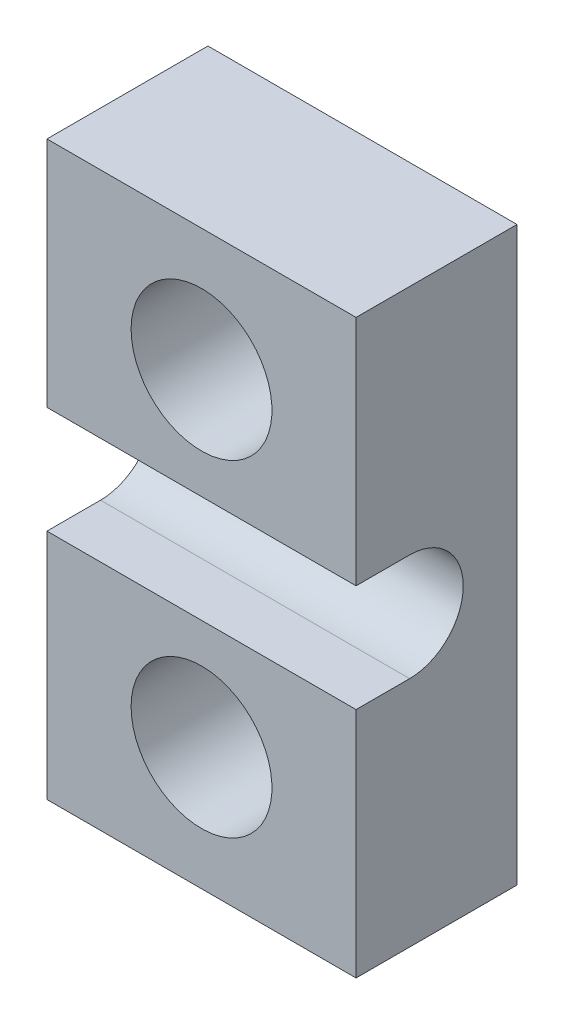
ISO-10303-21;
HEADER;
FILE_DESCRIPTION(('STEP AP214'),'2;1');
FILE_NAME('part.step','',(''),(''),'','','');
FILE_SCHEMA(('AUTOMOTIVE_DESIGN { 1 0 10303 214 1 1 1 1 }'));
ENDSEC;
DATA;
#1=APPLICATION_CONTEXT('core data for automotive mechanical design processes');
#2=APPLICATION_PROTOCOL_DEFINITION('international standard','automotive_design',2000,#1);
#3=PRODUCT_CONTEXT('',#1,'mechanical');
#4=PRODUCT('Part','Part','',(#3));
#5=PRODUCT_RELATED_PRODUCT_CATEGORY('part','',(#4));
#6=PRODUCT_DEFINITION_FORMATION('','',#4);
#7=PRODUCT_DEFINITION_CONTEXT('part definition',#1,'design');
#8=PRODUCT_DEFINITION('design','',#6,#7);
#9=PRODUCT_DEFINITION_SHAPE('','',#8);
#10=(LENGTH_UNIT() NAMED_UNIT(*) SI_UNIT(.MILLI.,.METRE.));
#11=(NAMED_UNIT(*) PLANE_ANGLE_UNIT() SI_UNIT($,.RADIAN.));
#12=(NAMED_UNIT(*) SI_UNIT($,.STERADIAN.) SOLID_ANGLE_UNIT());
#13=UNCERTAINTY_MEASURE_WITH_UNIT(LENGTH_MEASURE(1.E-05),#10,'distance_accuracy_value','');
#14=(GEOMETRIC_REPRESENTATION_CONTEXT(3) GLOBAL_UNCERTAINTY_ASSIGNED_CONTEXT((#13)) GLOBAL_UNIT_ASSIGNED_CONTEXT((#10,
#11,#12)) REPRESENTATION_CONTEXT('',''));
#15=CARTESIAN_POINT('',(0.,0.,0.));
#16=DIRECTION('',(0.,0.,1.));
#17=DIRECTION('',(1.,0.,0.));
#18=AXIS2_PLACEMENT_3D('',#15,#16,#17);
#19=CARTESIAN_POINT('',(0.,0.,3.2));
#20=DIRECTION('',(0.,0.,-1.));
#21=DIRECTION('',(-1.,0.,0.));
#22=AXIS2_PLACEMENT_3D('',#19,#20,#21);
#23=PLANE('',#22);
#24=CARTESIAN_POINT('',(213.478545955132,134.987907073244,3.2));
#25=DIRECTION('',(0.,0.,-1.));
#26=DIRECTION('',(-1.,0.,0.));
#27=AXIS2_PLACEMENT_3D('',#24,#25,#26);
#28=CIRCLE('',#27,1.40000000000001);
#29=CARTESIAN_POINT('',(212.078545955132,134.987907073244,3.2));
#30=VERTEX_POINT('',#29);
#31=EDGE_CURVE('E149',#30,#30,#28,.T.);
#32=ORIENTED_EDGE('',*,*,#31,.T.);
#33=EDGE_LOOP('',(#32));
#34=FACE_BOUND('',#33,.T.);
#35=DIRECTION('',(0.,1.,0.));
#36=VECTOR('',#35,1.);
#37=CARTESIAN_POINT('',(216.550959064884,143.924566425503,3.2));
#38=LINE('',#37,#36);
#39=CARTESIAN_POINT('',(216.550959064884,132.551247720986,3.2));
#40=VERTEX_POINT('',#39);
#41=CARTESIAN_POINT('',(216.550959064884,137.172907073244,3.2));
#42=VERTEX_POINT('',#41);
#43=EDGE_CURVE('E154',#40,#42,#38,.T.);
#44=ORIENTED_EDGE('',*,*,#43,.T.);
#45=DIRECTION('',(1.,0.,0.));
#46=VECTOR('',#45,1.);
#47=CARTESIAN_POINT('',(210.406132845381,137.172907073244,3.2));
#48=LINE('',#47,#46);
#49=CARTESIAN_POINT('',(210.406132845381,137.172907073244,3.2));
#50=VERTEX_POINT('',#49);
#51=EDGE_CURVE('E139',#50,#42,#48,.T.);
#52=ORIENTED_EDGE('',*,*,#51,.F.);
#53=DIRECTION('',(0.,-1.,0.));
#54=VECTOR('',#53,1.);
#55=CARTESIAN_POINT('',(210.406132845381,143.924566425503,3.2));
#56=LINE('',#55,#54);
#57=CARTESIAN_POINT('',(210.406132845381,132.551247720986,3.2));
#58=VERTEX_POINT('',#57);
#59=EDGE_CURVE('E158',#50,#58,#56,.T.);
#60=ORIENTED_EDGE('',*,*,#59,.T.);
#61=DIRECTION('',(1.,0.,0.));
#62=VECTOR('',#61,1.);
#63=CARTESIAN_POINT('',(216.550959064884,132.551247720986,3.2));
#64=LINE('',#63,#62);
#65=EDGE_CURVE('E57',#58,#40,#64,.T.);
#66=ORIENTED_EDGE('',*,*,#65,.T.);
#67=EDGE_LOOP('',(#44,#52,#60,#66));
#68=FACE_BOUND('',#67,.T.);
#69=ADVANCED_FACE('F33',(#34,#68),#23,.F.);
#70=CARTESIAN_POINT('',(216.550959064884,143.924566425503,3.2));
#71=DIRECTION('',(-1.,0.,0.));
#72=DIRECTION('',(0.,0.,1.));
#73=AXIS2_PLACEMENT_3D('',#70,#71,#72);
#74=PLANE('',#73);
#75=CARTESIAN_POINT('',(216.550959064884,138.237907073244,2.135));
#76=DIRECTION('',(1.,0.,0.));
#77=DIRECTION('',(0.,0.,-1.));
#78=AXIS2_PLACEMENT_3D('',#75,#76,#77);
#79=CIRCLE('',#78,1.06499999999998);
#80=CARTESIAN_POINT('',(216.550959064884,137.172907073244,2.135));
#81=VERTEX_POINT('',#80);
#82=CARTESIAN_POINT('',(216.550959064884,139.302907073244,2.135));
#83=VERTEX_POINT('',#82);
#84=EDGE_CURVE('E115',#81,#83,#79,.T.);
#85=ORIENTED_EDGE('',*,*,#84,.F.);
#86=DIRECTION('',(0.,0.,-1.));
#87=VECTOR('',#86,1.);
#88=CARTESIAN_POINT('',(216.550959064884,137.172907073244,2.135));
#89=LINE('',#88,#87);
#90=EDGE_CURVE('E128',#42,#81,#89,.T.);
#91=ORIENTED_EDGE('',*,*,#90,.F.);
#92=ORIENTED_EDGE('',*,*,#43,.F.);
#93=DIRECTION('',(0.,0.,-1.));
#94=VECTOR('',#93,1.);
#95=CARTESIAN_POINT('',(216.550959064884,132.551247720986,3.2));
#96=LINE('',#95,#94);
#97=CARTESIAN_POINT('',(216.550959064884,132.551247720986,0.));
#98=VERTEX_POINT('',#97);
#99=EDGE_CURVE('E162',#40,#98,#96,.T.);
#100=ORIENTED_EDGE('',*,*,#99,.T.);
#101=DIRECTION('',(0.,1.,0.));
#102=VECTOR('',#101,1.);
#103=CARTESIAN_POINT('',(216.550959064884,143.924566425503,0.));
#104=LINE('',#103,#102);
#105=CARTESIAN_POINT('',(216.550959064884,143.924566425503,0.));
#106=VERTEX_POINT('',#105);
#107=EDGE_CURVE('E145',#98,#106,#104,.T.);
#108=ORIENTED_EDGE('',*,*,#107,.T.);
#109=DIRECTION('',(0.,0.,-1.));
#110=VECTOR('',#109,1.);
#111=CARTESIAN_POINT('',(216.550959064884,143.924566425503,3.2));
#112=LINE('',#111,#110);
#113=CARTESIAN_POINT('',(216.550959064884,143.924566425503,3.2));
#114=VERTEX_POINT('',#113);
#115=EDGE_CURVE('E11',#114,#106,#112,.T.);
#116=ORIENTED_EDGE('',*,*,#115,.F.);
#117=CARTESIAN_POINT('',(216.550959064884,139.302907073244,3.2));
#118=VERTEX_POINT('',#117);
#119=EDGE_CURVE('E85',#118,#114,#38,.T.);
#120=ORIENTED_EDGE('',*,*,#119,.F.);
#121=DIRECTION('',(0.,0.,1.));
#122=VECTOR('',#121,1.);
#123=CARTESIAN_POINT('',(216.550959064884,139.302907073244,2.135));
#124=LINE('',#123,#122);
#125=EDGE_CURVE('E48',#83,#118,#124,.T.);
#126=ORIENTED_EDGE('',*,*,#125,.F.);
#127=EDGE_LOOP('',(#85,#91,#92,#100,#108,#116,#120,#126));
#128=FACE_BOUND('',#127,.T.);
#129=ADVANCED_FACE('F35',(#128),#74,.F.);
#130=CARTESIAN_POINT('',(216.550959064884,143.924566425503,3.2));
#131=DIRECTION('',(0.,-1.,0.));
#132=DIRECTION('',(0.,0.,-1.));
#133=AXIS2_PLACEMENT_3D('',#130,#131,#132);
#134=PLANE('',#133);
#135=DIRECTION('',(-1.,0.,0.));
#136=VECTOR('',#135,1.);
#137=CARTESIAN_POINT('',(216.550959064884,143.924566425503,0.));
#138=LINE('',#137,#136);
#139=CARTESIAN_POINT('',(210.406132845381,143.924566425503,0.));
#140=VERTEX_POINT('',#139);
#141=EDGE_CURVE('E165',#106,#140,#138,.T.);
#142=ORIENTED_EDGE('',*,*,#141,.T.);
#143=DIRECTION('',(0.,0.,-1.));
#144=VECTOR('',#143,1.);
#145=CARTESIAN_POINT('',(210.406132845381,143.924566425503,3.2));
#146=LINE('',#145,#144);
#147=CARTESIAN_POINT('',(210.406132845381,143.924566425503,3.2));
#148=VERTEX_POINT('',#147);
#149=EDGE_CURVE('E41',#148,#140,#146,.T.);
#150=ORIENTED_EDGE('',*,*,#149,.F.);
#151=DIRECTION('',(-1.,0.,0.));
#152=VECTOR('',#151,1.);
#153=CARTESIAN_POINT('',(216.550959064884,143.924566425503,3.2));
#154=LINE('',#153,#152);
#155=EDGE_CURVE('E156',#114,#148,#154,.T.);
#156=ORIENTED_EDGE('',*,*,#155,.F.);
#157=ORIENTED_EDGE('',*,*,#115,.T.);
#158=EDGE_LOOP('',(#142,#150,#156,#157));
#159=FACE_BOUND('',#158,.T.);
#160=ADVANCED_FACE('F204',(#159),#134,.F.);
#161=CARTESIAN_POINT('',(210.406132845381,143.924566425503,3.2));
#162=DIRECTION('',(1.,0.,0.));
#163=DIRECTION('',(0.,0.,-1.));
#164=AXIS2_PLACEMENT_3D('',#161,#162,#163);
#165=PLANE('',#164);
#166=ORIENTED_EDGE('',*,*,#59,.F.);
#167=DIRECTION('',(0.,0.,-1.));
#168=VECTOR('',#167,1.);
#169=CARTESIAN_POINT('',(210.406132845381,137.172907073244,2.135));
#170=LINE('',#169,#168);
#171=CARTESIAN_POINT('',(210.406132845381,137.172907073244,2.135));
#172=VERTEX_POINT('',#171);
#173=EDGE_CURVE('E117',#50,#172,#170,.T.);
#174=ORIENTED_EDGE('',*,*,#173,.T.);
#175=CARTESIAN_POINT('',(210.406132845381,138.237907073244,2.135));
#176=DIRECTION('',(1.,0.,0.));
#177=DIRECTION('',(0.,0.,-1.));
#178=AXIS2_PLACEMENT_3D('',#175,#176,#177);
#179=CIRCLE('',#178,1.06499999999998);
#180=CARTESIAN_POINT('',(210.406132845381,139.302907073244,2.135));
#181=VERTEX_POINT('',#180);
#182=EDGE_CURVE('E112',#172,#181,#179,.T.);
#183=ORIENTED_EDGE('',*,*,#182,.T.);
#184=DIRECTION('',(0.,0.,1.));
#185=VECTOR('',#184,1.);
#186=CARTESIAN_POINT('',(210.406132845381,139.302907073244,2.135));
#187=LINE('',#186,#185);
#188=CARTESIAN_POINT('',(210.406132845381,139.302907073244,3.2));
#189=VERTEX_POINT('',#188);
#190=EDGE_CURVE('E120',#181,#189,#187,.T.);
#191=ORIENTED_EDGE('',*,*,#190,.T.);
#192=EDGE_CURVE('E159',#148,#189,#56,.T.);
#193=ORIENTED_EDGE('',*,*,#192,.F.);
#194=ORIENTED_EDGE('',*,*,#149,.T.);
#195=DIRECTION('',(0.,-1.,0.));
#196=VECTOR('',#195,1.);
#197=CARTESIAN_POINT('',(210.406132845381,143.924566425503,0.));
#198=LINE('',#197,#196);
#199=CARTESIAN_POINT('',(210.406132845381,132.551247720986,0.));
#200=VERTEX_POINT('',#199);
#201=EDGE_CURVE('E167',#140,#200,#198,.T.);
#202=ORIENTED_EDGE('',*,*,#201,.T.);
#203=DIRECTION('',(0.,0.,-1.));
#204=VECTOR('',#203,1.);
#205=CARTESIAN_POINT('',(210.406132845381,132.551247720986,3.2));
#206=LINE('',#205,#204);
#207=EDGE_CURVE('E171',#58,#200,#206,.T.);
#208=ORIENTED_EDGE('',*,*,#207,.F.);
#209=EDGE_LOOP('',(#166,#174,#183,#191,#193,#194,#202,#208));
#210=FACE_BOUND('',#209,.T.);
#211=ADVANCED_FACE('F127',(#210),#165,.F.);
#212=CARTESIAN_POINT('',(216.550959064884,132.551247720986,3.2));
#213=DIRECTION('',(0.,1.,0.));
#214=DIRECTION('',(0.,0.,1.));
#215=AXIS2_PLACEMENT_3D('',#212,#213,#214);
#216=PLANE('',#215);
#217=DIRECTION('',(1.,0.,0.));
#218=VECTOR('',#217,1.);
#219=CARTESIAN_POINT('',(216.550959064884,132.551247720986,0.));
#220=LINE('',#219,#218);
#221=EDGE_CURVE('E78',#200,#98,#220,.T.);
#222=ORIENTED_EDGE('',*,*,#221,.T.);
#223=ORIENTED_EDGE('',*,*,#99,.F.);
#224=ORIENTED_EDGE('',*,*,#65,.F.);
#225=ORIENTED_EDGE('',*,*,#207,.T.);
#226=EDGE_LOOP('',(#222,#223,#224,#225));
#227=FACE_BOUND('',#226,.T.);
#228=ADVANCED_FACE('F184',(#227),#216,.F.);
#229=CARTESIAN_POINT('',(213.478545955132,141.487907073244,3.2));
#230=DIRECTION('',(0.,0.,-1.));
#231=DIRECTION('',(-1.,0.,0.));
#232=AXIS2_PLACEMENT_3D('',#229,#230,#231);
#233=CIRCLE('',#232,1.40000000000001);
#234=CARTESIAN_POINT('',(212.078545955132,141.487907073244,3.2));
#235=VERTEX_POINT('',#234);
#236=EDGE_CURVE('E142',#235,#235,#233,.T.);
#237=ORIENTED_EDGE('',*,*,#236,.T.);
#238=EDGE_LOOP('',(#237));
#239=FACE_BOUND('',#238,.T.);
#240=ORIENTED_EDGE('',*,*,#192,.T.);
#241=DIRECTION('',(1.,0.,0.));
#242=VECTOR('',#241,1.);
#243=CARTESIAN_POINT('',(210.406132845381,139.302907073244,3.2));
#244=LINE('',#243,#242);
#245=EDGE_CURVE('E116',#189,#118,#244,.T.);
#246=ORIENTED_EDGE('',*,*,#245,.T.);
#247=ORIENTED_EDGE('',*,*,#119,.T.);
#248=ORIENTED_EDGE('',*,*,#155,.T.);
#249=EDGE_LOOP('',(#240,#246,#247,#248));
#250=FACE_BOUND('',#249,.T.);
#251=ADVANCED_FACE('F200',(#239,#250),#23,.F.);
#252=CARTESIAN_POINT('',(0.,0.,0.));
#253=DIRECTION('',(0.,0.,-1.));
#254=DIRECTION('',(-1.,0.,0.));
#255=AXIS2_PLACEMENT_3D('',#252,#253,#254);
#256=PLANE('',#255);
#257=CARTESIAN_POINT('',(213.478545955132,141.487907073244,0.));
#258=DIRECTION('',(0.,0.,-1.));
#259=DIRECTION('',(-1.,0.,0.));
#260=AXIS2_PLACEMENT_3D('',#257,#258,#259);
#261=CIRCLE('',#260,1.40000000000001);
#262=CARTESIAN_POINT('',(212.078545955132,141.487907073244,0.));
#263=VERTEX_POINT('',#262);
#264=EDGE_CURVE('E146',#263,#263,#261,.T.);
#265=ORIENTED_EDGE('',*,*,#264,.F.);
#266=EDGE_LOOP('',(#265));
#267=FACE_BOUND('',#266,.T.);
#268=CARTESIAN_POINT('',(213.478545955132,134.987907073244,0.));
#269=DIRECTION('',(0.,0.,-1.));
#270=DIRECTION('',(-1.,0.,0.));
#271=AXIS2_PLACEMENT_3D('',#268,#269,#270);
#272=CIRCLE('',#271,1.40000000000001);
#273=CARTESIAN_POINT('',(212.078545955132,134.987907073244,0.));
#274=VERTEX_POINT('',#273);
#275=EDGE_CURVE('E138',#274,#274,#272,.T.);
#276=ORIENTED_EDGE('',*,*,#275,.F.);
#277=EDGE_LOOP('',(#276));
#278=FACE_BOUND('',#277,.T.);
#279=ORIENTED_EDGE('',*,*,#107,.F.);
#280=ORIENTED_EDGE('',*,*,#221,.F.);
#281=ORIENTED_EDGE('',*,*,#201,.F.);
#282=ORIENTED_EDGE('',*,*,#141,.F.);
#283=EDGE_LOOP('',(#279,#280,#281,#282));
#284=FACE_BOUND('',#283,.T.);
#285=ADVANCED_FACE('F179',(#267,#278,#284),#256,.T.);
#286=CARTESIAN_POINT('',(213.478545955132,134.987907073244,3.2));
#287=DIRECTION('',(0.,0.,-1.));
#288=DIRECTION('',(-1.,0.,0.));
#289=AXIS2_PLACEMENT_3D('',#286,#287,#288);
#290=CYLINDRICAL_SURFACE('',#289,1.40000000000001);
#291=ORIENTED_EDGE('',*,*,#31,.F.);
#292=EDGE_LOOP('',(#291));
#293=FACE_BOUND('',#292,.T.);
#294=ORIENTED_EDGE('',*,*,#275,.T.);
#295=EDGE_LOOP('',(#294));
#296=FACE_BOUND('',#295,.T.);
#297=ADVANCED_FACE('F213',(#293,#296),#290,.F.);
#298=CARTESIAN_POINT('',(213.478545955132,141.487907073244,3.2));
#299=DIRECTION('',(0.,0.,-1.));
#300=DIRECTION('',(-1.,0.,0.));
#301=AXIS2_PLACEMENT_3D('',#298,#299,#300);
#302=CYLINDRICAL_SURFACE('',#301,1.40000000000001);
#303=ORIENTED_EDGE('',*,*,#236,.F.);
#304=EDGE_LOOP('',(#303));
#305=FACE_BOUND('',#304,.T.);
#306=ORIENTED_EDGE('',*,*,#264,.T.);
#307=EDGE_LOOP('',(#306));
#308=FACE_BOUND('',#307,.T.);
#309=ADVANCED_FACE('F195',(#305,#308),#302,.F.);
#310=CARTESIAN_POINT('',(210.406132845381,138.237907073244,2.135));
#311=DIRECTION('',(1.,0.,0.));
#312=DIRECTION('',(0.,0.,-1.));
#313=AXIS2_PLACEMENT_3D('',#310,#311,#312);
#314=CYLINDRICAL_SURFACE('',#313,1.06499999999998);
#315=ORIENTED_EDGE('',*,*,#84,.T.);
#316=DIRECTION('',(1.,0.,0.));
#317=VECTOR('',#316,1.);
#318=CARTESIAN_POINT('',(210.406132845381,139.302907073244,2.135));
#319=LINE('',#318,#317);
#320=EDGE_CURVE('E108',#181,#83,#319,.T.);
#321=ORIENTED_EDGE('',*,*,#320,.F.);
#322=ORIENTED_EDGE('',*,*,#182,.F.);
#323=DIRECTION('',(1.,0.,0.));
#324=VECTOR('',#323,1.);
#325=CARTESIAN_POINT('',(210.406132845381,137.172907073244,2.135));
#326=LINE('',#325,#324);
#327=EDGE_CURVE('E136',#172,#81,#326,.T.);
#328=ORIENTED_EDGE('',*,*,#327,.T.);
#329=EDGE_LOOP('',(#315,#321,#322,#328));
#330=FACE_BOUND('',#329,.T.);
#331=ADVANCED_FACE('F110',(#330),#314,.F.);
#332=CARTESIAN_POINT('',(210.406132845381,137.172907073244,2.135));
#333=DIRECTION('',(0.,-1.,0.));
#334=DIRECTION('',(0.,0.,-1.));
#335=AXIS2_PLACEMENT_3D('',#332,#333,#334);
#336=PLANE('',#335);
#337=ORIENTED_EDGE('',*,*,#90,.T.);
#338=ORIENTED_EDGE('',*,*,#327,.F.);
#339=ORIENTED_EDGE('',*,*,#173,.F.);
#340=ORIENTED_EDGE('',*,*,#51,.T.);
#341=EDGE_LOOP('',(#337,#338,#339,#340));
#342=FACE_BOUND('',#341,.T.);
#343=ADVANCED_FACE('F187',(#342),#336,.F.);
#344=CARTESIAN_POINT('',(210.406132845381,139.302907073244,2.135));
#345=DIRECTION('',(0.,1.,0.));
#346=DIRECTION('',(0.,0.,1.));
#347=AXIS2_PLACEMENT_3D('',#344,#345,#346);
#348=PLANE('',#347);
#349=ORIENTED_EDGE('',*,*,#125,.T.);
#350=ORIENTED_EDGE('',*,*,#245,.F.);
#351=ORIENTED_EDGE('',*,*,#190,.F.);
#352=ORIENTED_EDGE('',*,*,#320,.T.);
#353=EDGE_LOOP('',(#349,#350,#351,#352));
#354=FACE_BOUND('',#353,.T.);
#355=ADVANCED_FACE('F121',(#354),#348,.F.);
#356=CLOSED_SHELL('',(#69,#129,#160,#211,#228,#251,#285,#297,#309,#331,#343,#355));
#357=MANIFOLD_SOLID_BREP('B2',#356);
#358=ADVANCED_BREP_SHAPE_REPRESENTATION('',(#18,#357),#14);
#359=SHAPE_DEFINITION_REPRESENTATION(#9,#358);
ENDSEC;
END-ISO-10303-21;
